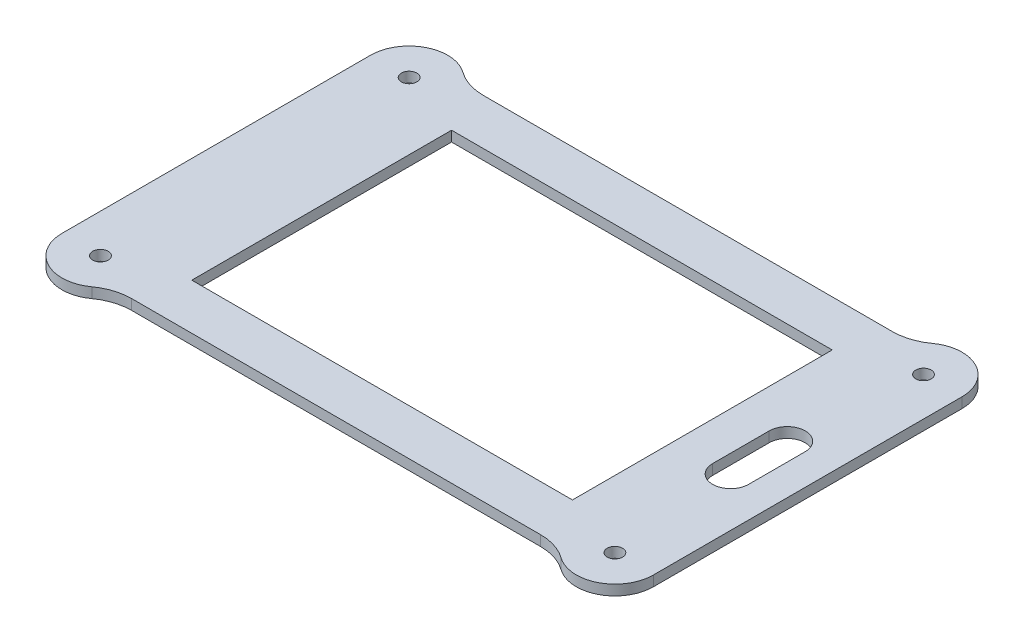
ISO-10303-21;
HEADER;
FILE_DESCRIPTION(('STEP AP214'),'2;1');
FILE_NAME('part.step','',(''),(''),'','','');
FILE_SCHEMA(('AUTOMOTIVE_DESIGN { 1 0 10303 214 1 1 1 1 }'));
ENDSEC;
DATA;
#1=APPLICATION_CONTEXT('core data for automotive mechanical design processes');
#2=APPLICATION_PROTOCOL_DEFINITION('international standard','automotive_design',2000,#1);
#3=PRODUCT_CONTEXT('',#1,'mechanical');
#4=PRODUCT('Part','Part','',(#3));
#5=PRODUCT_RELATED_PRODUCT_CATEGORY('part','',(#4));
#6=PRODUCT_DEFINITION_FORMATION('','',#4);
#7=PRODUCT_DEFINITION_CONTEXT('part definition',#1,'design');
#8=PRODUCT_DEFINITION('design','',#6,#7);
#9=PRODUCT_DEFINITION_SHAPE('','',#8);
#10=(LENGTH_UNIT() NAMED_UNIT(*) SI_UNIT(.MILLI.,.METRE.));
#11=(NAMED_UNIT(*) PLANE_ANGLE_UNIT() SI_UNIT($,.RADIAN.));
#12=(NAMED_UNIT(*) SI_UNIT($,.STERADIAN.) SOLID_ANGLE_UNIT());
#13=UNCERTAINTY_MEASURE_WITH_UNIT(LENGTH_MEASURE(1.E-05),#10,'distance_accuracy_value','');
#14=(GEOMETRIC_REPRESENTATION_CONTEXT(3) GLOBAL_UNCERTAINTY_ASSIGNED_CONTEXT((#13)) GLOBAL_UNIT_ASSIGNED_CONTEXT((#10,
#11,#12)) REPRESENTATION_CONTEXT('',''));
#15=CARTESIAN_POINT('',(0.,0.,0.));
#16=DIRECTION('',(0.,0.,1.));
#17=DIRECTION('',(1.,0.,0.));
#18=AXIS2_PLACEMENT_3D('',#15,#16,#17);
#19=CARTESIAN_POINT('',(-50.,2.,-30.));
#20=DIRECTION('',(0.,-1.,0.));
#21=DIRECTION('',(0.,0.,-1.));
#22=AXIS2_PLACEMENT_3D('',#19,#20,#21);
#23=CYLINDRICAL_SURFACE('',#22,7.5);
#24=CARTESIAN_POINT('',(-50.,2.,-30.));
#25=DIRECTION('',(0.,1.,0.));
#26=DIRECTION('',(0.,0.,1.));
#27=AXIS2_PLACEMENT_3D('',#24,#25,#26);
#28=CIRCLE('',#27,7.5);
#29=CARTESIAN_POINT('',(-45.6134427741734,2.,-36.0834296005254));
#30=VERTEX_POINT('',#29);
#31=CARTESIAN_POINT('',(-57.5,2.,-30.));
#32=VERTEX_POINT('',#31);
#33=EDGE_CURVE('E292',#30,#32,#28,.T.);
#34=ORIENTED_EDGE('',*,*,#33,.F.);
#35=DIRECTION('',(0.,-1.,0.));
#36=VECTOR('',#35,1.);
#37=CARTESIAN_POINT('',(-45.6134427741734,2.,-36.0834296005254));
#38=LINE('',#37,#36);
#39=CARTESIAN_POINT('',(-45.6134427741734,0.,-36.0834296005254));
#40=VERTEX_POINT('',#39);
#41=EDGE_CURVE('E175',#30,#40,#38,.T.);
#42=ORIENTED_EDGE('',*,*,#41,.T.);
#43=CARTESIAN_POINT('',(-50.,0.,-30.));
#44=DIRECTION('',(0.,1.,0.));
#45=DIRECTION('',(0.,0.,1.));
#46=AXIS2_PLACEMENT_3D('',#43,#44,#45);
#47=CIRCLE('',#46,7.5);
#48=CARTESIAN_POINT('',(-57.5,0.,-30.));
#49=VERTEX_POINT('',#48);
#50=EDGE_CURVE('E169',#40,#49,#47,.T.);
#51=ORIENTED_EDGE('',*,*,#50,.T.);
#52=DIRECTION('',(0.,1.,0.));
#53=VECTOR('',#52,1.);
#54=CARTESIAN_POINT('',(-57.5,0.,-30.));
#55=LINE('',#54,#53);
#56=EDGE_CURVE('E173',#49,#32,#55,.T.);
#57=ORIENTED_EDGE('',*,*,#56,.T.);
#58=EDGE_LOOP('',(#34,#42,#51,#57));
#59=FACE_BOUND('',#58,.T.);
#60=ADVANCED_FACE('F32',(#59),#23,.T.);
#61=CARTESIAN_POINT('',(-50.,2.,-30.));
#62=DIRECTION('',(0.,1.,0.));
#63=DIRECTION('',(0.,0.,1.));
#64=AXIS2_PLACEMENT_3D('',#61,#62,#63);
#65=PLANE('',#64);
#66=CARTESIAN_POINT('',(-50.,2.,-30.));
#67=DIRECTION('',(0.,1.,0.));
#68=DIRECTION('',(0.,0.,1.));
#69=AXIS2_PLACEMENT_3D('',#66,#67,#68);
#70=CIRCLE('',#69,1.5);
#71=CARTESIAN_POINT('',(-50.,2.,-28.5));
#72=VERTEX_POINT('',#71);
#73=EDGE_CURVE('E245',#72,#72,#70,.T.);
#74=ORIENTED_EDGE('',*,*,#73,.F.);
#75=EDGE_LOOP('',(#74));
#76=FACE_BOUND('',#75,.T.);
#77=CARTESIAN_POINT('',(-50.,2.,30.));
#78=DIRECTION('',(0.,1.,0.));
#79=DIRECTION('',(0.,0.,1.));
#80=AXIS2_PLACEMENT_3D('',#77,#78,#79);
#81=CIRCLE('',#80,1.5);
#82=CARTESIAN_POINT('',(-50.,2.,31.5));
#83=VERTEX_POINT('',#82);
#84=EDGE_CURVE('E257',#83,#83,#81,.T.);
#85=ORIENTED_EDGE('',*,*,#84,.F.);
#86=EDGE_LOOP('',(#85));
#87=FACE_BOUND('',#86,.T.);
#88=DIRECTION('',(-1.,0.,0.));
#89=VECTOR('',#88,1.);
#90=CARTESIAN_POINT('',(-43.7827054588941,2.,-34.1946690678925));
#91=LINE('',#90,#89);
#92=CARTESIAN_POINT('',(39.7646998064045,2.,-34.1946690678925));
#93=VERTEX_POINT('',#92);
#94=CARTESIAN_POINT('',(-39.7646998064045,2.,-34.1946690678925));
#95=VERTEX_POINT('',#94);
#96=EDGE_CURVE('E305',#93,#95,#91,.T.);
#97=ORIENTED_EDGE('',*,*,#96,.T.);
#98=CARTESIAN_POINT('',(-39.7646998064045,2.,-44.1946690678925));
#99=DIRECTION('',(0.,1.,0.));
#100=DIRECTION('',(0.,0.,1.));
#101=AXIS2_PLACEMENT_3D('',#98,#99,#100);
#102=CIRCLE('',#101,10.);
#103=EDGE_CURVE('E338',#95,#30,#102,.F.);
#104=ORIENTED_EDGE('',*,*,#103,.T.);
#105=ORIENTED_EDGE('',*,*,#33,.T.);
#106=DIRECTION('',(0.,0.,-1.));
#107=VECTOR('',#106,1.);
#108=CARTESIAN_POINT('',(-57.5,2.,-30.));
#109=LINE('',#108,#107);
#110=CARTESIAN_POINT('',(-57.5,2.,30.));
#111=VERTEX_POINT('',#110);
#112=EDGE_CURVE('E188',#111,#32,#109,.T.);
#113=ORIENTED_EDGE('',*,*,#112,.F.);
#114=CARTESIAN_POINT('',(-50.,2.,30.));
#115=DIRECTION('',(0.,1.,0.));
#116=DIRECTION('',(0.,0.,1.));
#117=AXIS2_PLACEMENT_3D('',#114,#115,#116);
#118=CIRCLE('',#117,7.5);
#119=CARTESIAN_POINT('',(-45.6134427741734,2.,36.0834296005254));
#120=VERTEX_POINT('',#119);
#121=EDGE_CURVE('E294',#111,#120,#118,.T.);
#122=ORIENTED_EDGE('',*,*,#121,.T.);
#123=CARTESIAN_POINT('',(-39.7646998064045,2.,44.1946690678925));
#124=DIRECTION('',(0.,1.,0.));
#125=DIRECTION('',(0.,0.,1.));
#126=AXIS2_PLACEMENT_3D('',#123,#124,#125);
#127=CIRCLE('',#126,10.);
#128=CARTESIAN_POINT('',(-39.7646998064045,2.,34.1946690678925));
#129=VERTEX_POINT('',#128);
#130=EDGE_CURVE('E342',#120,#129,#127,.F.);
#131=ORIENTED_EDGE('',*,*,#130,.T.);
#132=DIRECTION('',(1.,0.,0.));
#133=VECTOR('',#132,1.);
#134=CARTESIAN_POINT('',(-43.7827054588941,2.,34.1946690678925));
#135=LINE('',#134,#133);
#136=CARTESIAN_POINT('',(39.7646998064045,2.,34.1946690678925));
#137=VERTEX_POINT('',#136);
#138=EDGE_CURVE('E298',#129,#137,#135,.T.);
#139=ORIENTED_EDGE('',*,*,#138,.T.);
#140=CARTESIAN_POINT('',(39.7646998064045,2.,44.1946690678925));
#141=DIRECTION('',(0.,1.,0.));
#142=DIRECTION('',(0.,0.,1.));
#143=AXIS2_PLACEMENT_3D('',#140,#141,#142);
#144=CIRCLE('',#143,10.);
#145=CARTESIAN_POINT('',(45.6134427741734,2.,36.0834296005253));
#146=VERTEX_POINT('',#145);
#147=EDGE_CURVE('E11',#137,#146,#144,.F.);
#148=ORIENTED_EDGE('',*,*,#147,.T.);
#149=CARTESIAN_POINT('',(50.,2.,30.));
#150=DIRECTION('',(0.,1.,0.));
#151=DIRECTION('',(0.,0.,1.));
#152=AXIS2_PLACEMENT_3D('',#149,#150,#151);
#153=CIRCLE('',#152,7.5);
#154=CARTESIAN_POINT('',(57.5,2.,30.));
#155=VERTEX_POINT('',#154);
#156=EDGE_CURVE('E300',#146,#155,#153,.T.);
#157=ORIENTED_EDGE('',*,*,#156,.T.);
#158=DIRECTION('',(0.,0.,-1.));
#159=VECTOR('',#158,1.);
#160=CARTESIAN_POINT('',(57.5,2.,-30.));
#161=LINE('',#160,#159);
#162=CARTESIAN_POINT('',(57.5,2.,-30.));
#163=VERTEX_POINT('',#162);
#164=EDGE_CURVE('E194',#155,#163,#161,.T.);
#165=ORIENTED_EDGE('',*,*,#164,.T.);
#166=CARTESIAN_POINT('',(50.,2.,-30.));
#167=DIRECTION('',(0.,1.,0.));
#168=DIRECTION('',(0.,0.,1.));
#169=AXIS2_PLACEMENT_3D('',#166,#167,#168);
#170=CIRCLE('',#169,7.5);
#171=CARTESIAN_POINT('',(45.6134427741734,2.,-36.0834296005254));
#172=VERTEX_POINT('',#171);
#173=EDGE_CURVE('E302',#163,#172,#170,.T.);
#174=ORIENTED_EDGE('',*,*,#173,.T.);
#175=CARTESIAN_POINT('',(39.7646998064045,2.,-44.1946690678925));
#176=DIRECTION('',(0.,1.,0.));
#177=DIRECTION('',(0.,0.,1.));
#178=AXIS2_PLACEMENT_3D('',#175,#176,#177);
#179=CIRCLE('',#178,10.);
#180=EDGE_CURVE('E346',#172,#93,#179,.F.);
#181=ORIENTED_EDGE('',*,*,#180,.T.);
#182=EDGE_LOOP('',(#97,#104,#105,#113,#122,#131,#139,#148,#157,#165,#174,#181));
#183=FACE_BOUND('',#182,.T.);
#184=CARTESIAN_POINT('',(50.,2.,-30.));
#185=DIRECTION('',(0.,1.,0.));
#186=DIRECTION('',(0.,0.,1.));
#187=AXIS2_PLACEMENT_3D('',#184,#185,#186);
#188=CIRCLE('',#187,1.5);
#189=CARTESIAN_POINT('',(50.,2.,-28.5));
#190=VERTEX_POINT('',#189);
#191=EDGE_CURVE('E239',#190,#190,#188,.T.);
#192=ORIENTED_EDGE('',*,*,#191,.F.);
#193=EDGE_LOOP('',(#192));
#194=FACE_BOUND('',#193,.T.);
#195=CARTESIAN_POINT('',(48.,2.,-5.49999999999999));
#196=DIRECTION('',(0.,1.,0.));
#197=DIRECTION('',(0.,0.,1.));
#198=AXIS2_PLACEMENT_3D('',#195,#196,#197);
#199=CIRCLE('',#198,3.49999999999999);
#200=CARTESIAN_POINT('',(51.5,2.,-5.49999999999999));
#201=VERTEX_POINT('',#200);
#202=CARTESIAN_POINT('',(44.5,2.,-5.49999999999999));
#203=VERTEX_POINT('',#202);
#204=EDGE_CURVE('E208',#201,#203,#199,.T.);
#205=ORIENTED_EDGE('',*,*,#204,.F.);
#206=DIRECTION('',(0.,0.,-1.));
#207=VECTOR('',#206,1.);
#208=CARTESIAN_POINT('',(51.5,2.,-5.49999999999999));
#209=LINE('',#208,#207);
#210=CARTESIAN_POINT('',(51.5,2.,5.49999999999998));
#211=VERTEX_POINT('',#210);
#212=EDGE_CURVE('E216',#211,#201,#209,.T.);
#213=ORIENTED_EDGE('',*,*,#212,.F.);
#214=CARTESIAN_POINT('',(48.,2.,5.49999999999999));
#215=DIRECTION('',(0.,1.,0.));
#216=DIRECTION('',(0.,0.,1.));
#217=AXIS2_PLACEMENT_3D('',#214,#215,#216);
#218=CIRCLE('',#217,3.49999999999999);
#219=CARTESIAN_POINT('',(44.5,2.,5.49999999999998));
#220=VERTEX_POINT('',#219);
#221=EDGE_CURVE('E213',#220,#211,#218,.T.);
#222=ORIENTED_EDGE('',*,*,#221,.F.);
#223=DIRECTION('',(0.,0.,1.));
#224=VECTOR('',#223,1.);
#225=CARTESIAN_POINT('',(44.5,2.,-5.49999999999999));
#226=LINE('',#225,#224);
#227=EDGE_CURVE('E210',#203,#220,#226,.T.);
#228=ORIENTED_EDGE('',*,*,#227,.F.);
#229=EDGE_LOOP('',(#205,#213,#222,#228));
#230=FACE_BOUND('',#229,.T.);
#231=CARTESIAN_POINT('',(50.,2.,30.));
#232=DIRECTION('',(0.,1.,0.));
#233=DIRECTION('',(0.,0.,1.));
#234=AXIS2_PLACEMENT_3D('',#231,#232,#233);
#235=CIRCLE('',#234,1.5);
#236=CARTESIAN_POINT('',(50.,2.,31.5));
#237=VERTEX_POINT('',#236);
#238=EDGE_CURVE('E251',#237,#237,#235,.T.);
#239=ORIENTED_EDGE('',*,*,#238,.F.);
#240=EDGE_LOOP('',(#239));
#241=FACE_BOUND('',#240,.T.);
#242=DIRECTION('',(1.,0.,0.));
#243=VECTOR('',#242,1.);
#244=CARTESIAN_POINT('',(-37.,2.,25.25));
#245=LINE('',#244,#243);
#246=CARTESIAN_POINT('',(-37.,2.,25.25));
#247=VERTEX_POINT('',#246);
#248=CARTESIAN_POINT('',(37.,2.,25.25));
#249=VERTEX_POINT('',#248);
#250=EDGE_CURVE('E265',#247,#249,#245,.T.);
#251=ORIENTED_EDGE('',*,*,#250,.F.);
#252=DIRECTION('',(0.,0.,1.));
#253=VECTOR('',#252,1.);
#254=CARTESIAN_POINT('',(-37.,2.,-25.25));
#255=LINE('',#254,#253);
#256=CARTESIAN_POINT('',(-37.,2.,-25.25));
#257=VERTEX_POINT('',#256);
#258=EDGE_CURVE('E263',#257,#247,#255,.T.);
#259=ORIENTED_EDGE('',*,*,#258,.F.);
#260=DIRECTION('',(-1.,0.,0.));
#261=VECTOR('',#260,1.);
#262=CARTESIAN_POINT('',(-37.,2.,-25.25));
#263=LINE('',#262,#261);
#264=CARTESIAN_POINT('',(37.,2.,-25.25));
#265=VERTEX_POINT('',#264);
#266=EDGE_CURVE('E271',#265,#257,#263,.T.);
#267=ORIENTED_EDGE('',*,*,#266,.F.);
#268=DIRECTION('',(0.,0.,-1.));
#269=VECTOR('',#268,1.);
#270=CARTESIAN_POINT('',(37.,2.,-25.25));
#271=LINE('',#270,#269);
#272=EDGE_CURVE('E268',#249,#265,#271,.T.);
#273=ORIENTED_EDGE('',*,*,#272,.F.);
#274=EDGE_LOOP('',(#251,#259,#267,#273));
#275=FACE_BOUND('',#274,.T.);
#276=ADVANCED_FACE('F358',(#76,#87,#183,#194,#230,#241,#275),#65,.T.);
#277=CARTESIAN_POINT('',(-50.,0.,-30.));
#278=DIRECTION('',(0.,1.,0.));
#279=DIRECTION('',(0.,0.,1.));
#280=AXIS2_PLACEMENT_3D('',#277,#278,#279);
#281=PLANE('',#280);
#282=CARTESIAN_POINT('',(-50.,0.,-30.));
#283=DIRECTION('',(0.,1.,0.));
#284=DIRECTION('',(0.,0.,1.));
#285=AXIS2_PLACEMENT_3D('',#282,#283,#284);
#286=CIRCLE('',#285,1.5);
#287=CARTESIAN_POINT('',(-50.,0.,-28.5));
#288=VERTEX_POINT('',#287);
#289=EDGE_CURVE('E242',#288,#288,#286,.T.);
#290=ORIENTED_EDGE('',*,*,#289,.T.);
#291=EDGE_LOOP('',(#290));
#292=FACE_BOUND('',#291,.T.);
#293=CARTESIAN_POINT('',(-50.,0.,30.));
#294=DIRECTION('',(0.,1.,0.));
#295=DIRECTION('',(0.,0.,1.));
#296=AXIS2_PLACEMENT_3D('',#293,#294,#295);
#297=CIRCLE('',#296,1.5);
#298=CARTESIAN_POINT('',(-50.,0.,31.5));
#299=VERTEX_POINT('',#298);
#300=EDGE_CURVE('E254',#299,#299,#297,.T.);
#301=ORIENTED_EDGE('',*,*,#300,.T.);
#302=EDGE_LOOP('',(#301));
#303=FACE_BOUND('',#302,.T.);
#304=DIRECTION('',(0.,0.,-1.));
#305=VECTOR('',#304,1.);
#306=CARTESIAN_POINT('',(-57.5,0.,-30.));
#307=LINE('',#306,#305);
#308=CARTESIAN_POINT('',(-57.5,0.,30.));
#309=VERTEX_POINT('',#308);
#310=EDGE_CURVE('E181',#309,#49,#307,.T.);
#311=ORIENTED_EDGE('',*,*,#310,.T.);
#312=ORIENTED_EDGE('',*,*,#50,.F.);
#313=CARTESIAN_POINT('',(-39.7646998064045,0.,-44.1946690678925));
#314=DIRECTION('',(0.,1.,0.));
#315=DIRECTION('',(0.,0.,1.));
#316=AXIS2_PLACEMENT_3D('',#313,#314,#315);
#317=CIRCLE('',#316,10.);
#318=CARTESIAN_POINT('',(-39.7646998064045,0.,-34.1946690678925));
#319=VERTEX_POINT('',#318);
#320=EDGE_CURVE('E336',#40,#319,#317,.T.);
#321=ORIENTED_EDGE('',*,*,#320,.T.);
#322=DIRECTION('',(-1.,0.,0.));
#323=VECTOR('',#322,1.);
#324=CARTESIAN_POINT('',(-43.7827054588941,0.,-34.1946690678925));
#325=LINE('',#324,#323);
#326=CARTESIAN_POINT('',(39.7646998064045,0.,-34.1946690678925));
#327=VERTEX_POINT('',#326);
#328=EDGE_CURVE('E295',#327,#319,#325,.T.);
#329=ORIENTED_EDGE('',*,*,#328,.F.);
#330=CARTESIAN_POINT('',(39.7646998064045,0.,-44.1946690678925));
#331=DIRECTION('',(0.,1.,0.));
#332=DIRECTION('',(0.,0.,1.));
#333=AXIS2_PLACEMENT_3D('',#330,#331,#332);
#334=CIRCLE('',#333,10.);
#335=CARTESIAN_POINT('',(45.6134427741734,0.,-36.0834296005254));
#336=VERTEX_POINT('',#335);
#337=EDGE_CURVE('E344',#327,#336,#334,.T.);
#338=ORIENTED_EDGE('',*,*,#337,.T.);
#339=CARTESIAN_POINT('',(50.,0.,-30.));
#340=DIRECTION('',(0.,1.,0.));
#341=DIRECTION('',(0.,0.,1.));
#342=AXIS2_PLACEMENT_3D('',#339,#340,#341);
#343=CIRCLE('',#342,7.5);
#344=CARTESIAN_POINT('',(57.5,0.,-30.));
#345=VERTEX_POINT('',#344);
#346=EDGE_CURVE('E314',#345,#336,#343,.T.);
#347=ORIENTED_EDGE('',*,*,#346,.F.);
#348=DIRECTION('',(0.,0.,-1.));
#349=VECTOR('',#348,1.);
#350=CARTESIAN_POINT('',(57.5,0.,-30.));
#351=LINE('',#350,#349);
#352=CARTESIAN_POINT('',(57.5,0.,30.));
#353=VERTEX_POINT('',#352);
#354=EDGE_CURVE('E198',#353,#345,#351,.T.);
#355=ORIENTED_EDGE('',*,*,#354,.F.);
#356=CARTESIAN_POINT('',(50.,0.,30.));
#357=DIRECTION('',(0.,1.,0.));
#358=DIRECTION('',(0.,0.,1.));
#359=AXIS2_PLACEMENT_3D('',#356,#357,#358);
#360=CIRCLE('',#359,7.5);
#361=CARTESIAN_POINT('',(45.6134427741734,0.,36.0834296005253));
#362=VERTEX_POINT('',#361);
#363=EDGE_CURVE('E312',#362,#353,#360,.T.);
#364=ORIENTED_EDGE('',*,*,#363,.F.);
#365=CARTESIAN_POINT('',(39.7646998064045,0.,44.1946690678925));
#366=DIRECTION('',(0.,1.,0.));
#367=DIRECTION('',(0.,0.,1.));
#368=AXIS2_PLACEMENT_3D('',#365,#366,#367);
#369=CIRCLE('',#368,10.);
#370=CARTESIAN_POINT('',(39.7646998064045,0.,34.1946690678925));
#371=VERTEX_POINT('',#370);
#372=EDGE_CURVE('E40',#362,#371,#369,.T.);
#373=ORIENTED_EDGE('',*,*,#372,.T.);
#374=DIRECTION('',(1.,0.,0.));
#375=VECTOR('',#374,1.);
#376=CARTESIAN_POINT('',(-43.7827054588941,0.,34.1946690678925));
#377=LINE('',#376,#375);
#378=CARTESIAN_POINT('',(-39.7646998064045,0.,34.1946690678925));
#379=VERTEX_POINT('',#378);
#380=EDGE_CURVE('E309',#379,#371,#377,.T.);
#381=ORIENTED_EDGE('',*,*,#380,.F.);
#382=CARTESIAN_POINT('',(-39.7646998064045,0.,44.1946690678925));
#383=DIRECTION('',(0.,1.,0.));
#384=DIRECTION('',(0.,0.,1.));
#385=AXIS2_PLACEMENT_3D('',#382,#383,#384);
#386=CIRCLE('',#385,10.);
#387=CARTESIAN_POINT('',(-45.6134427741734,0.,36.0834296005254));
#388=VERTEX_POINT('',#387);
#389=EDGE_CURVE('E340',#379,#388,#386,.T.);
#390=ORIENTED_EDGE('',*,*,#389,.T.);
#391=CARTESIAN_POINT('',(-50.,0.,30.));
#392=DIRECTION('',(0.,1.,0.));
#393=DIRECTION('',(0.,0.,1.));
#394=AXIS2_PLACEMENT_3D('',#391,#392,#393);
#395=CIRCLE('',#394,7.5);
#396=EDGE_CURVE('E177',#309,#388,#395,.T.);
#397=ORIENTED_EDGE('',*,*,#396,.F.);
#398=EDGE_LOOP('',(#311,#312,#321,#329,#338,#347,#355,#364,#373,#381,#390,#397));
#399=FACE_BOUND('',#398,.T.);
#400=DIRECTION('',(0.,0.,1.));
#401=VECTOR('',#400,1.);
#402=CARTESIAN_POINT('',(-37.,0.,-25.25));
#403=LINE('',#402,#401);
#404=CARTESIAN_POINT('',(-37.,0.,-25.25));
#405=VERTEX_POINT('',#404);
#406=CARTESIAN_POINT('',(-37.,0.,25.25));
#407=VERTEX_POINT('',#406);
#408=EDGE_CURVE('E260',#405,#407,#403,.T.);
#409=ORIENTED_EDGE('',*,*,#408,.T.);
#410=DIRECTION('',(1.,0.,0.));
#411=VECTOR('',#410,1.);
#412=CARTESIAN_POINT('',(-37.,0.,25.25));
#413=LINE('',#412,#411);
#414=CARTESIAN_POINT('',(37.,0.,25.25));
#415=VERTEX_POINT('',#414);
#416=EDGE_CURVE('E276',#407,#415,#413,.T.);
#417=ORIENTED_EDGE('',*,*,#416,.T.);
#418=DIRECTION('',(0.,0.,-1.));
#419=VECTOR('',#418,1.);
#420=CARTESIAN_POINT('',(37.,0.,-25.25));
#421=LINE('',#420,#419);
#422=CARTESIAN_POINT('',(37.,0.,-25.25));
#423=VERTEX_POINT('',#422);
#424=EDGE_CURVE('E279',#415,#423,#421,.T.);
#425=ORIENTED_EDGE('',*,*,#424,.T.);
#426=DIRECTION('',(-1.,0.,0.));
#427=VECTOR('',#426,1.);
#428=CARTESIAN_POINT('',(-37.,0.,-25.25));
#429=LINE('',#428,#427);
#430=EDGE_CURVE('E266',#423,#405,#429,.T.);
#431=ORIENTED_EDGE('',*,*,#430,.T.);
#432=EDGE_LOOP('',(#409,#417,#425,#431));
#433=FACE_BOUND('',#432,.T.);
#434=CARTESIAN_POINT('',(50.,0.,30.));
#435=DIRECTION('',(0.,1.,0.));
#436=DIRECTION('',(0.,0.,1.));
#437=AXIS2_PLACEMENT_3D('',#434,#435,#436);
#438=CIRCLE('',#437,1.5);
#439=CARTESIAN_POINT('',(50.,0.,31.5));
#440=VERTEX_POINT('',#439);
#441=EDGE_CURVE('E248',#440,#440,#438,.T.);
#442=ORIENTED_EDGE('',*,*,#441,.T.);
#443=EDGE_LOOP('',(#442));
#444=FACE_BOUND('',#443,.T.);
#445=DIRECTION('',(0.,0.,-1.));
#446=VECTOR('',#445,1.);
#447=CARTESIAN_POINT('',(51.5,0.,-5.49999999999999));
#448=LINE('',#447,#446);
#449=CARTESIAN_POINT('',(51.5,0.,5.49999999999998));
#450=VERTEX_POINT('',#449);
#451=CARTESIAN_POINT('',(51.5,0.,-5.49999999999998));
#452=VERTEX_POINT('',#451);
#453=EDGE_CURVE('E211',#450,#452,#448,.T.);
#454=ORIENTED_EDGE('',*,*,#453,.T.);
#455=CARTESIAN_POINT('',(48.,0.,-5.49999999999999));
#456=DIRECTION('',(0.,1.,0.));
#457=DIRECTION('',(0.,0.,1.));
#458=AXIS2_PLACEMENT_3D('',#455,#456,#457);
#459=CIRCLE('',#458,3.49999999999999);
#460=CARTESIAN_POINT('',(44.5,0.,-5.49999999999999));
#461=VERTEX_POINT('',#460);
#462=EDGE_CURVE('E205',#452,#461,#459,.T.);
#463=ORIENTED_EDGE('',*,*,#462,.T.);
#464=DIRECTION('',(0.,0.,1.));
#465=VECTOR('',#464,1.);
#466=CARTESIAN_POINT('',(44.5,0.,-5.49999999999999));
#467=LINE('',#466,#465);
#468=CARTESIAN_POINT('',(44.5,0.,5.49999999999998));
#469=VERTEX_POINT('',#468);
#470=EDGE_CURVE('E221',#461,#469,#467,.T.);
#471=ORIENTED_EDGE('',*,*,#470,.T.);
#472=CARTESIAN_POINT('',(48.,0.,5.49999999999999));
#473=DIRECTION('',(0.,1.,0.));
#474=DIRECTION('',(0.,0.,1.));
#475=AXIS2_PLACEMENT_3D('',#472,#473,#474);
#476=CIRCLE('',#475,3.49999999999999);
#477=EDGE_CURVE('E224',#469,#450,#476,.T.);
#478=ORIENTED_EDGE('',*,*,#477,.T.);
#479=EDGE_LOOP('',(#454,#463,#471,#478));
#480=FACE_BOUND('',#479,.T.);
#481=CARTESIAN_POINT('',(50.,0.,-30.));
#482=DIRECTION('',(0.,1.,0.));
#483=DIRECTION('',(0.,0.,1.));
#484=AXIS2_PLACEMENT_3D('',#481,#482,#483);
#485=CIRCLE('',#484,1.5);
#486=CARTESIAN_POINT('',(50.,0.,-28.5));
#487=VERTEX_POINT('',#486);
#488=EDGE_CURVE('E238',#487,#487,#485,.T.);
#489=ORIENTED_EDGE('',*,*,#488,.T.);
#490=EDGE_LOOP('',(#489));
#491=FACE_BOUND('',#490,.T.);
#492=ADVANCED_FACE('F182',(#292,#303,#399,#433,#444,#480,#491),#281,.F.);
#493=CARTESIAN_POINT('',(-50.,2.,30.));
#494=DIRECTION('',(0.,-1.,0.));
#495=DIRECTION('',(0.,0.,-1.));
#496=AXIS2_PLACEMENT_3D('',#493,#494,#495);
#497=CYLINDRICAL_SURFACE('',#496,7.5);
#498=ORIENTED_EDGE('',*,*,#396,.T.);
#499=DIRECTION('',(0.,-1.,0.));
#500=VECTOR('',#499,1.);
#501=CARTESIAN_POINT('',(-45.6134427741734,2.,36.0834296005254));
#502=LINE('',#501,#500);
#503=EDGE_CURVE('E330',#388,#120,#502,.F.);
#504=ORIENTED_EDGE('',*,*,#503,.T.);
#505=ORIENTED_EDGE('',*,*,#121,.F.);
#506=DIRECTION('',(0.,1.,0.));
#507=VECTOR('',#506,1.);
#508=CARTESIAN_POINT('',(-57.5,0.,30.));
#509=LINE('',#508,#507);
#510=EDGE_CURVE('E192',#309,#111,#509,.T.);
#511=ORIENTED_EDGE('',*,*,#510,.F.);
#512=EDGE_LOOP('',(#498,#504,#505,#511));
#513=FACE_BOUND('',#512,.T.);
#514=ADVANCED_FACE('F383',(#513),#497,.T.);
#515=CARTESIAN_POINT('',(-43.7827054588941,2.,34.1946690678925));
#516=DIRECTION('',(0.,0.,-1.));
#517=DIRECTION('',(-1.,0.,0.));
#518=AXIS2_PLACEMENT_3D('',#515,#516,#517);
#519=PLANE('',#518);
#520=ORIENTED_EDGE('',*,*,#138,.F.);
#521=DIRECTION('',(0.,1.,0.));
#522=VECTOR('',#521,1.);
#523=CARTESIAN_POINT('',(-39.7646998064045,0.,34.1946690678925));
#524=LINE('',#523,#522);
#525=EDGE_CURVE('E327',#129,#379,#524,.F.);
#526=ORIENTED_EDGE('',*,*,#525,.T.);
#527=ORIENTED_EDGE('',*,*,#380,.T.);
#528=DIRECTION('',(0.,1.,0.));
#529=VECTOR('',#528,1.);
#530=CARTESIAN_POINT('',(39.7646998064045,2.,34.1946690678925));
#531=LINE('',#530,#529);
#532=EDGE_CURVE('E325',#371,#137,#531,.T.);
#533=ORIENTED_EDGE('',*,*,#532,.T.);
#534=EDGE_LOOP('',(#520,#526,#527,#533));
#535=FACE_BOUND('',#534,.T.);
#536=ADVANCED_FACE('F352',(#535),#519,.F.);
#537=CARTESIAN_POINT('',(50.,2.,30.));
#538=DIRECTION('',(0.,-1.,0.));
#539=DIRECTION('',(0.,0.,-1.));
#540=AXIS2_PLACEMENT_3D('',#537,#538,#539);
#541=CYLINDRICAL_SURFACE('',#540,7.5);
#542=ORIENTED_EDGE('',*,*,#156,.F.);
#543=DIRECTION('',(0.,-1.,0.));
#544=VECTOR('',#543,1.);
#545=CARTESIAN_POINT('',(45.6134427741734,2.,36.0834296005254));
#546=LINE('',#545,#544);
#547=EDGE_CURVE('E334',#146,#362,#546,.T.);
#548=ORIENTED_EDGE('',*,*,#547,.T.);
#549=ORIENTED_EDGE('',*,*,#363,.T.);
#550=DIRECTION('',(0.,1.,0.));
#551=VECTOR('',#550,1.);
#552=CARTESIAN_POINT('',(57.5,0.,30.));
#553=LINE('',#552,#551);
#554=EDGE_CURVE('E200',#353,#155,#553,.T.);
#555=ORIENTED_EDGE('',*,*,#554,.T.);
#556=EDGE_LOOP('',(#542,#548,#549,#555));
#557=FACE_BOUND('',#556,.T.);
#558=ADVANCED_FACE('F355',(#557),#541,.T.);
#559=CARTESIAN_POINT('',(50.,2.,-30.));
#560=DIRECTION('',(0.,-1.,0.));
#561=DIRECTION('',(0.,0.,-1.));
#562=AXIS2_PLACEMENT_3D('',#559,#560,#561);
#563=CYLINDRICAL_SURFACE('',#562,7.5);
#564=ORIENTED_EDGE('',*,*,#346,.T.);
#565=DIRECTION('',(0.,-1.,0.));
#566=VECTOR('',#565,1.);
#567=CARTESIAN_POINT('',(45.6134427741734,2.,-36.0834296005254));
#568=LINE('',#567,#566);
#569=EDGE_CURVE('E332',#336,#172,#568,.F.);
#570=ORIENTED_EDGE('',*,*,#569,.T.);
#571=ORIENTED_EDGE('',*,*,#173,.F.);
#572=DIRECTION('',(0.,1.,0.));
#573=VECTOR('',#572,1.);
#574=CARTESIAN_POINT('',(57.5,0.,-30.));
#575=LINE('',#574,#573);
#576=EDGE_CURVE('E202',#345,#163,#575,.T.);
#577=ORIENTED_EDGE('',*,*,#576,.F.);
#578=EDGE_LOOP('',(#564,#570,#571,#577));
#579=FACE_BOUND('',#578,.T.);
#580=ADVANCED_FACE('F366',(#579),#563,.T.);
#581=CARTESIAN_POINT('',(-43.7827054588941,2.,-34.1946690678925));
#582=DIRECTION('',(0.,0.,1.));
#583=DIRECTION('',(1.,0.,0.));
#584=AXIS2_PLACEMENT_3D('',#581,#582,#583);
#585=PLANE('',#584);
#586=ORIENTED_EDGE('',*,*,#328,.T.);
#587=DIRECTION('',(0.,1.,0.));
#588=VECTOR('',#587,1.);
#589=CARTESIAN_POINT('',(-39.7646998064045,2.,-34.1946690678925));
#590=LINE('',#589,#588);
#591=EDGE_CURVE('E323',#319,#95,#590,.T.);
#592=ORIENTED_EDGE('',*,*,#591,.T.);
#593=ORIENTED_EDGE('',*,*,#96,.F.);
#594=DIRECTION('',(0.,1.,0.));
#595=VECTOR('',#594,1.);
#596=CARTESIAN_POINT('',(39.7646998064045,0.,-34.1946690678925));
#597=LINE('',#596,#595);
#598=EDGE_CURVE('E320',#93,#327,#597,.F.);
#599=ORIENTED_EDGE('',*,*,#598,.T.);
#600=EDGE_LOOP('',(#586,#592,#593,#599));
#601=FACE_BOUND('',#600,.T.);
#602=ADVANCED_FACE('F375',(#601),#585,.F.);
#603=CARTESIAN_POINT('',(-37.,2.,-25.25));
#604=DIRECTION('',(1.,0.,0.));
#605=DIRECTION('',(0.,0.,-1.));
#606=AXIS2_PLACEMENT_3D('',#603,#604,#605);
#607=PLANE('',#606);
#608=ORIENTED_EDGE('',*,*,#408,.F.);
#609=DIRECTION('',(0.,-1.,0.));
#610=VECTOR('',#609,1.);
#611=CARTESIAN_POINT('',(-37.,2.,-25.25));
#612=LINE('',#611,#610);
#613=EDGE_CURVE('E273',#257,#405,#612,.T.);
#614=ORIENTED_EDGE('',*,*,#613,.F.);
#615=ORIENTED_EDGE('',*,*,#258,.T.);
#616=DIRECTION('',(0.,-1.,0.));
#617=VECTOR('',#616,1.);
#618=CARTESIAN_POINT('',(-37.,2.,25.25));
#619=LINE('',#618,#617);
#620=EDGE_CURVE('E178',#247,#407,#619,.T.);
#621=ORIENTED_EDGE('',*,*,#620,.T.);
#622=EDGE_LOOP('',(#608,#614,#615,#621));
#623=FACE_BOUND('',#622,.T.);
#624=ADVANCED_FACE('F412',(#623),#607,.T.);
#625=CARTESIAN_POINT('',(-37.,2.,25.25));
#626=DIRECTION('',(0.,0.,-1.));
#627=DIRECTION('',(-1.,0.,0.));
#628=AXIS2_PLACEMENT_3D('',#625,#626,#627);
#629=PLANE('',#628);
#630=ORIENTED_EDGE('',*,*,#416,.F.);
#631=ORIENTED_EDGE('',*,*,#620,.F.);
#632=ORIENTED_EDGE('',*,*,#250,.T.);
#633=DIRECTION('',(0.,-1.,0.));
#634=VECTOR('',#633,1.);
#635=CARTESIAN_POINT('',(37.,2.,25.25));
#636=LINE('',#635,#634);
#637=EDGE_CURVE('E288',#249,#415,#636,.T.);
#638=ORIENTED_EDGE('',*,*,#637,.T.);
#639=EDGE_LOOP('',(#630,#631,#632,#638));
#640=FACE_BOUND('',#639,.T.);
#641=ADVANCED_FACE('F418',(#640),#629,.T.);
#642=CARTESIAN_POINT('',(37.,2.,-25.25));
#643=DIRECTION('',(-1.,0.,0.));
#644=DIRECTION('',(0.,0.,1.));
#645=AXIS2_PLACEMENT_3D('',#642,#643,#644);
#646=PLANE('',#645);
#647=ORIENTED_EDGE('',*,*,#424,.F.);
#648=ORIENTED_EDGE('',*,*,#637,.F.);
#649=ORIENTED_EDGE('',*,*,#272,.T.);
#650=DIRECTION('',(0.,-1.,0.));
#651=VECTOR('',#650,1.);
#652=CARTESIAN_POINT('',(37.,2.,-25.25));
#653=LINE('',#652,#651);
#654=EDGE_CURVE('E286',#265,#423,#653,.T.);
#655=ORIENTED_EDGE('',*,*,#654,.T.);
#656=EDGE_LOOP('',(#647,#648,#649,#655));
#657=FACE_BOUND('',#656,.T.);
#658=ADVANCED_FACE('F422',(#657),#646,.T.);
#659=CARTESIAN_POINT('',(-37.,2.,-25.25));
#660=DIRECTION('',(0.,0.,1.));
#661=DIRECTION('',(1.,0.,0.));
#662=AXIS2_PLACEMENT_3D('',#659,#660,#661);
#663=PLANE('',#662);
#664=ORIENTED_EDGE('',*,*,#430,.F.);
#665=ORIENTED_EDGE('',*,*,#654,.F.);
#666=ORIENTED_EDGE('',*,*,#266,.T.);
#667=ORIENTED_EDGE('',*,*,#613,.T.);
#668=EDGE_LOOP('',(#664,#665,#666,#667));
#669=FACE_BOUND('',#668,.T.);
#670=ADVANCED_FACE('F426',(#669),#663,.T.);
#671=CARTESIAN_POINT('',(-50.,2.,30.));
#672=DIRECTION('',(0.,-1.,0.));
#673=DIRECTION('',(0.,0.,-1.));
#674=AXIS2_PLACEMENT_3D('',#671,#672,#673);
#675=CYLINDRICAL_SURFACE('',#674,1.5);
#676=ORIENTED_EDGE('',*,*,#84,.T.);
#677=EDGE_LOOP('',(#676));
#678=FACE_BOUND('',#677,.T.);
#679=ORIENTED_EDGE('',*,*,#300,.F.);
#680=EDGE_LOOP('',(#679));
#681=FACE_BOUND('',#680,.T.);
#682=ADVANCED_FACE('F430',(#678,#681),#675,.F.);
#683=CARTESIAN_POINT('',(50.,2.,30.));
#684=DIRECTION('',(0.,-1.,0.));
#685=DIRECTION('',(0.,0.,-1.));
#686=AXIS2_PLACEMENT_3D('',#683,#684,#685);
#687=CYLINDRICAL_SURFACE('',#686,1.5);
#688=ORIENTED_EDGE('',*,*,#441,.F.);
#689=EDGE_LOOP('',(#688));
#690=FACE_BOUND('',#689,.T.);
#691=ORIENTED_EDGE('',*,*,#238,.T.);
#692=EDGE_LOOP('',(#691));
#693=FACE_BOUND('',#692,.T.);
#694=ADVANCED_FACE('F434',(#690,#693),#687,.F.);
#695=CARTESIAN_POINT('',(-50.,2.,-30.));
#696=DIRECTION('',(0.,-1.,0.));
#697=DIRECTION('',(0.,0.,-1.));
#698=AXIS2_PLACEMENT_3D('',#695,#696,#697);
#699=CYLINDRICAL_SURFACE('',#698,1.5);
#700=ORIENTED_EDGE('',*,*,#289,.F.);
#701=EDGE_LOOP('',(#700));
#702=FACE_BOUND('',#701,.T.);
#703=ORIENTED_EDGE('',*,*,#73,.T.);
#704=EDGE_LOOP('',(#703));
#705=FACE_BOUND('',#704,.T.);
#706=ADVANCED_FACE('F438',(#702,#705),#699,.F.);
#707=CARTESIAN_POINT('',(50.,2.,-30.));
#708=DIRECTION('',(0.,-1.,0.));
#709=DIRECTION('',(0.,0.,-1.));
#710=AXIS2_PLACEMENT_3D('',#707,#708,#709);
#711=CYLINDRICAL_SURFACE('',#710,1.5);
#712=ORIENTED_EDGE('',*,*,#488,.F.);
#713=EDGE_LOOP('',(#712));
#714=FACE_BOUND('',#713,.T.);
#715=ORIENTED_EDGE('',*,*,#191,.T.);
#716=EDGE_LOOP('',(#715));
#717=FACE_BOUND('',#716,.T.);
#718=ADVANCED_FACE('F442',(#714,#717),#711,.F.);
#719=CARTESIAN_POINT('',(48.,2.,-5.49999999999999));
#720=DIRECTION('',(0.,-1.,0.));
#721=DIRECTION('',(0.,0.,-1.));
#722=AXIS2_PLACEMENT_3D('',#719,#720,#721);
#723=CYLINDRICAL_SURFACE('',#722,3.49999999999999);
#724=ORIENTED_EDGE('',*,*,#462,.F.);
#725=DIRECTION('',(0.,-1.,0.));
#726=VECTOR('',#725,1.);
#727=CARTESIAN_POINT('',(51.5,2.,-5.49999999999999));
#728=LINE('',#727,#726);
#729=EDGE_CURVE('E218',#201,#452,#728,.T.);
#730=ORIENTED_EDGE('',*,*,#729,.F.);
#731=ORIENTED_EDGE('',*,*,#204,.T.);
#732=DIRECTION('',(0.,-1.,0.));
#733=VECTOR('',#732,1.);
#734=CARTESIAN_POINT('',(44.5,2.,-5.49999999999999));
#735=LINE('',#734,#733);
#736=EDGE_CURVE('E235',#203,#461,#735,.T.);
#737=ORIENTED_EDGE('',*,*,#736,.T.);
#738=EDGE_LOOP('',(#724,#730,#731,#737));
#739=FACE_BOUND('',#738,.T.);
#740=ADVANCED_FACE('F446',(#739),#723,.F.);
#741=CARTESIAN_POINT('',(44.5,2.,-5.49999999999999));
#742=DIRECTION('',(1.,0.,0.));
#743=DIRECTION('',(0.,0.,-1.));
#744=AXIS2_PLACEMENT_3D('',#741,#742,#743);
#745=PLANE('',#744);
#746=ORIENTED_EDGE('',*,*,#470,.F.);
#747=ORIENTED_EDGE('',*,*,#736,.F.);
#748=ORIENTED_EDGE('',*,*,#227,.T.);
#749=DIRECTION('',(0.,-1.,0.));
#750=VECTOR('',#749,1.);
#751=CARTESIAN_POINT('',(44.5,2.,5.49999999999998));
#752=LINE('',#751,#750);
#753=EDGE_CURVE('E233',#220,#469,#752,.T.);
#754=ORIENTED_EDGE('',*,*,#753,.T.);
#755=EDGE_LOOP('',(#746,#747,#748,#754));
#756=FACE_BOUND('',#755,.T.);
#757=ADVANCED_FACE('F450',(#756),#745,.T.);
#758=CARTESIAN_POINT('',(48.,2.,5.49999999999999));
#759=DIRECTION('',(0.,-1.,0.));
#760=DIRECTION('',(0.,0.,-1.));
#761=AXIS2_PLACEMENT_3D('',#758,#759,#760);
#762=CYLINDRICAL_SURFACE('',#761,3.49999999999999);
#763=ORIENTED_EDGE('',*,*,#477,.F.);
#764=ORIENTED_EDGE('',*,*,#753,.F.);
#765=ORIENTED_EDGE('',*,*,#221,.T.);
#766=DIRECTION('',(0.,-1.,0.));
#767=VECTOR('',#766,1.);
#768=CARTESIAN_POINT('',(51.5,2.,5.49999999999998));
#769=LINE('',#768,#767);
#770=EDGE_CURVE('E231',#211,#450,#769,.T.);
#771=ORIENTED_EDGE('',*,*,#770,.T.);
#772=EDGE_LOOP('',(#763,#764,#765,#771));
#773=FACE_BOUND('',#772,.T.);
#774=ADVANCED_FACE('F454',(#773),#762,.F.);
#775=CARTESIAN_POINT('',(51.5,2.,-5.49999999999999));
#776=DIRECTION('',(-1.,0.,0.));
#777=DIRECTION('',(0.,0.,1.));
#778=AXIS2_PLACEMENT_3D('',#775,#776,#777);
#779=PLANE('',#778);
#780=ORIENTED_EDGE('',*,*,#453,.F.);
#781=ORIENTED_EDGE('',*,*,#770,.F.);
#782=ORIENTED_EDGE('',*,*,#212,.T.);
#783=ORIENTED_EDGE('',*,*,#729,.T.);
#784=EDGE_LOOP('',(#780,#781,#782,#783));
#785=FACE_BOUND('',#784,.T.);
#786=ADVANCED_FACE('F458',(#785),#779,.T.);
#787=CARTESIAN_POINT('',(57.5,0.,-30.));
#788=DIRECTION('',(1.,0.,0.));
#789=DIRECTION('',(0.,0.,-1.));
#790=AXIS2_PLACEMENT_3D('',#787,#788,#789);
#791=PLANE('',#790);
#792=ORIENTED_EDGE('',*,*,#164,.F.);
#793=ORIENTED_EDGE('',*,*,#554,.F.);
#794=ORIENTED_EDGE('',*,*,#354,.T.);
#795=ORIENTED_EDGE('',*,*,#576,.T.);
#796=EDGE_LOOP('',(#792,#793,#794,#795));
#797=FACE_BOUND('',#796,.T.);
#798=ADVANCED_FACE('F361',(#797),#791,.T.);
#799=CARTESIAN_POINT('',(-57.5,0.,-30.));
#800=DIRECTION('',(1.,0.,0.));
#801=DIRECTION('',(0.,0.,-1.));
#802=AXIS2_PLACEMENT_3D('',#799,#800,#801);
#803=PLANE('',#802);
#804=ORIENTED_EDGE('',*,*,#112,.T.);
#805=ORIENTED_EDGE('',*,*,#56,.F.);
#806=ORIENTED_EDGE('',*,*,#310,.F.);
#807=ORIENTED_EDGE('',*,*,#510,.T.);
#808=EDGE_LOOP('',(#804,#805,#806,#807));
#809=FACE_BOUND('',#808,.T.);
#810=ADVANCED_FACE('F191',(#809),#803,.F.);
#811=CARTESIAN_POINT('',(-39.7646998064045,2.,-44.1946690678925));
#812=DIRECTION('',(0.,-1.,0.));
#813=DIRECTION('',(0.,0.,-1.));
#814=AXIS2_PLACEMENT_3D('',#811,#812,#813);
#815=CYLINDRICAL_SURFACE('',#814,10.);
#816=ORIENTED_EDGE('',*,*,#103,.F.);
#817=ORIENTED_EDGE('',*,*,#591,.F.);
#818=ORIENTED_EDGE('',*,*,#320,.F.);
#819=ORIENTED_EDGE('',*,*,#41,.F.);
#820=EDGE_LOOP('',(#816,#817,#818,#819));
#821=FACE_BOUND('',#820,.T.);
#822=ADVANCED_FACE('F379',(#821),#815,.F.);
#823=CARTESIAN_POINT('',(-39.7646998064045,2.,44.1946690678925));
#824=DIRECTION('',(0.,-1.,0.));
#825=DIRECTION('',(0.,0.,-1.));
#826=AXIS2_PLACEMENT_3D('',#823,#824,#825);
#827=CYLINDRICAL_SURFACE('',#826,10.);
#828=ORIENTED_EDGE('',*,*,#130,.F.);
#829=ORIENTED_EDGE('',*,*,#503,.F.);
#830=ORIENTED_EDGE('',*,*,#389,.F.);
#831=ORIENTED_EDGE('',*,*,#525,.F.);
#832=EDGE_LOOP('',(#828,#829,#830,#831));
#833=FACE_BOUND('',#832,.T.);
#834=ADVANCED_FACE('F386',(#833),#827,.F.);
#835=CARTESIAN_POINT('',(39.7646998064045,2.,-44.1946690678925));
#836=DIRECTION('',(0.,-1.,0.));
#837=DIRECTION('',(0.,0.,-1.));
#838=AXIS2_PLACEMENT_3D('',#835,#836,#837);
#839=CYLINDRICAL_SURFACE('',#838,10.);
#840=ORIENTED_EDGE('',*,*,#180,.F.);
#841=ORIENTED_EDGE('',*,*,#569,.F.);
#842=ORIENTED_EDGE('',*,*,#337,.F.);
#843=ORIENTED_EDGE('',*,*,#598,.F.);
#844=EDGE_LOOP('',(#840,#841,#842,#843));
#845=FACE_BOUND('',#844,.T.);
#846=ADVANCED_FACE('F372',(#845),#839,.F.);
#847=CARTESIAN_POINT('',(39.7646998064045,2.,44.1946690678925));
#848=DIRECTION('',(0.,-1.,0.));
#849=DIRECTION('',(0.,0.,-1.));
#850=AXIS2_PLACEMENT_3D('',#847,#848,#849);
#851=CYLINDRICAL_SURFACE('',#850,10.);
#852=ORIENTED_EDGE('',*,*,#147,.F.);
#853=ORIENTED_EDGE('',*,*,#532,.F.);
#854=ORIENTED_EDGE('',*,*,#372,.F.);
#855=ORIENTED_EDGE('',*,*,#547,.F.);
#856=EDGE_LOOP('',(#852,#853,#854,#855));
#857=FACE_BOUND('',#856,.T.);
#858=ADVANCED_FACE('F34',(#857),#851,.F.);
#859=CLOSED_SHELL('',(#60,#276,#492,#514,#536,#558,#580,#602,#624,#641,#658,#670,#682,#694,#706,
#718,#740,#757,#774,#786,#798,#810,#822,#834,#846,#858));
#860=MANIFOLD_SOLID_BREP('B2',#859);
#861=ADVANCED_BREP_SHAPE_REPRESENTATION('',(#18,#860),#14);
#862=SHAPE_DEFINITION_REPRESENTATION(#9,#861);
ENDSEC;
END-ISO-10303-21;
